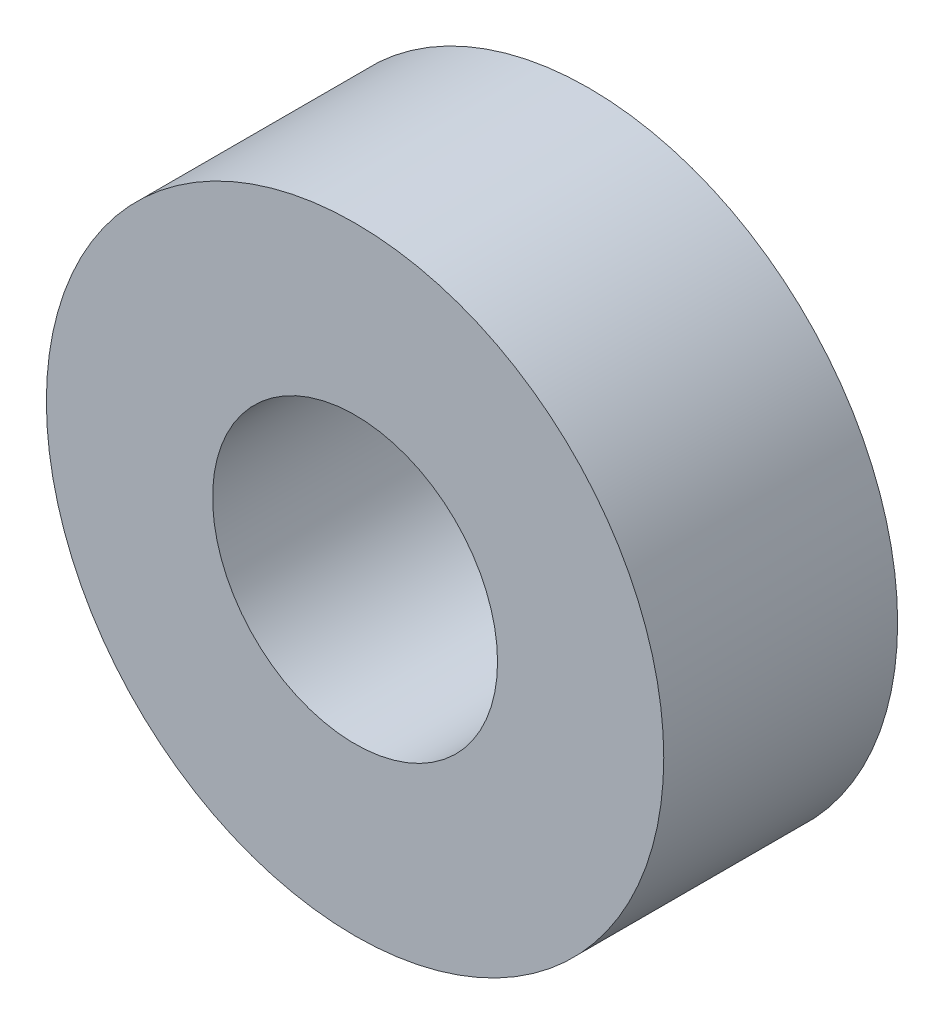
ISO-10303-21;
HEADER;
FILE_DESCRIPTION(('STEP AP214'),'2;1');
FILE_NAME('part.step','',(''),(''),'','','');
FILE_SCHEMA(('AUTOMOTIVE_DESIGN { 1 0 10303 214 1 1 1 1 }'));
ENDSEC;
DATA;
#1=APPLICATION_CONTEXT('core data for automotive mechanical design processes');
#2=APPLICATION_PROTOCOL_DEFINITION('international standard','automotive_design',2000,#1);
#3=PRODUCT_CONTEXT('',#1,'mechanical');
#4=PRODUCT('Part','Part','',(#3));
#5=PRODUCT_RELATED_PRODUCT_CATEGORY('part','',(#4));
#6=PRODUCT_DEFINITION_FORMATION('','',#4);
#7=PRODUCT_DEFINITION_CONTEXT('part definition',#1,'design');
#8=PRODUCT_DEFINITION('design','',#6,#7);
#9=PRODUCT_DEFINITION_SHAPE('','',#8);
#10=(LENGTH_UNIT() NAMED_UNIT(*) SI_UNIT(.MILLI.,.METRE.));
#11=(NAMED_UNIT(*) PLANE_ANGLE_UNIT() SI_UNIT($,.RADIAN.));
#12=(NAMED_UNIT(*) SI_UNIT($,.STERADIAN.) SOLID_ANGLE_UNIT());
#13=UNCERTAINTY_MEASURE_WITH_UNIT(LENGTH_MEASURE(1.E-05),#10,'distance_accuracy_value','');
#14=(GEOMETRIC_REPRESENTATION_CONTEXT(3) GLOBAL_UNCERTAINTY_ASSIGNED_CONTEXT((#13)) GLOBAL_UNIT_ASSIGNED_CONTEXT((#10,
#11,#12)) REPRESENTATION_CONTEXT('',''));
#15=CARTESIAN_POINT('',(0.,0.,0.));
#16=DIRECTION('',(0.,0.,1.));
#17=DIRECTION('',(1.,0.,0.));
#18=AXIS2_PLACEMENT_3D('',#15,#16,#17);
#19=CARTESIAN_POINT('',(0.,0.,5.));
#20=DIRECTION('',(0.,0.,1.));
#21=DIRECTION('',(1.,0.,0.));
#22=AXIS2_PLACEMENT_3D('',#19,#20,#21);
#23=PLANE('',#22);
#24=CARTESIAN_POINT('',(0.,0.,5.));
#25=DIRECTION('',(0.,0.,1.));
#26=DIRECTION('',(1.,0.,0.));
#27=AXIS2_PLACEMENT_3D('',#24,#25,#26);
#28=CIRCLE('',#27,6.6);
#29=CARTESIAN_POINT('',(6.6,0.,5.));
#30=VERTEX_POINT('',#29);
#31=EDGE_CURVE('E10',#30,#30,#28,.T.);
#32=ORIENTED_EDGE('',*,*,#31,.T.);
#33=EDGE_LOOP('',(#32));
#34=FACE_BOUND('',#33,.T.);
#35=CARTESIAN_POINT('',(0.,0.,5.));
#36=DIRECTION('',(0.,0.,1.));
#37=DIRECTION('',(1.,0.,0.));
#38=AXIS2_PLACEMENT_3D('',#35,#36,#37);
#39=CIRCLE('',#38,3.04615384615385);
#40=CARTESIAN_POINT('',(3.04615384615385,0.,5.));
#41=VERTEX_POINT('',#40);
#42=EDGE_CURVE('E42',#41,#41,#39,.T.);
#43=ORIENTED_EDGE('',*,*,#42,.F.);
#44=EDGE_LOOP('',(#43));
#45=FACE_BOUND('',#44,.T.);
#46=ADVANCED_FACE('F31',(#34,#45),#23,.T.);
#47=CARTESIAN_POINT('',(0.,0.,0.));
#48=DIRECTION('',(0.,0.,1.));
#49=DIRECTION('',(1.,0.,0.));
#50=AXIS2_PLACEMENT_3D('',#47,#48,#49);
#51=PLANE('',#50);
#52=CARTESIAN_POINT('',(0.,0.,0.));
#53=DIRECTION('',(0.,0.,1.));
#54=DIRECTION('',(1.,0.,0.));
#55=AXIS2_PLACEMENT_3D('',#52,#53,#54);
#56=CIRCLE('',#55,6.6);
#57=CARTESIAN_POINT('',(6.6,0.,0.));
#58=VERTEX_POINT('',#57);
#59=EDGE_CURVE('E35',#58,#58,#56,.T.);
#60=ORIENTED_EDGE('',*,*,#59,.F.);
#61=EDGE_LOOP('',(#60));
#62=FACE_BOUND('',#61,.T.);
#63=CARTESIAN_POINT('',(0.,0.,0.));
#64=DIRECTION('',(0.,0.,1.));
#65=DIRECTION('',(1.,0.,0.));
#66=AXIS2_PLACEMENT_3D('',#63,#64,#65);
#67=CIRCLE('',#66,3.04615384615385);
#68=CARTESIAN_POINT('',(3.04615384615385,0.,0.));
#69=VERTEX_POINT('',#68);
#70=EDGE_CURVE('E44',#69,#69,#67,.T.);
#71=ORIENTED_EDGE('',*,*,#70,.T.);
#72=EDGE_LOOP('',(#71));
#73=FACE_BOUND('',#72,.T.);
#74=ADVANCED_FACE('F54',(#62,#73),#51,.F.);
#75=CARTESIAN_POINT('',(0.,0.,5.));
#76=DIRECTION('',(0.,0.,-1.));
#77=DIRECTION('',(-1.,0.,0.));
#78=AXIS2_PLACEMENT_3D('',#75,#76,#77);
#79=CYLINDRICAL_SURFACE('',#78,6.6);
#80=ORIENTED_EDGE('',*,*,#31,.F.);
#81=EDGE_LOOP('',(#80));
#82=FACE_BOUND('',#81,.T.);
#83=ORIENTED_EDGE('',*,*,#59,.T.);
#84=EDGE_LOOP('',(#83));
#85=FACE_BOUND('',#84,.T.);
#86=ADVANCED_FACE('F33',(#82,#85),#79,.T.);
#87=CARTESIAN_POINT('',(0.,0.,5.));
#88=DIRECTION('',(0.,0.,-1.));
#89=DIRECTION('',(-1.,0.,0.));
#90=AXIS2_PLACEMENT_3D('',#87,#88,#89);
#91=CYLINDRICAL_SURFACE('',#90,3.04615384615385);
#92=ORIENTED_EDGE('',*,*,#42,.T.);
#93=EDGE_LOOP('',(#92));
#94=FACE_BOUND('',#93,.T.);
#95=ORIENTED_EDGE('',*,*,#70,.F.);
#96=EDGE_LOOP('',(#95));
#97=FACE_BOUND('',#96,.T.);
#98=ADVANCED_FACE('F50',(#94,#97),#91,.F.);
#99=CLOSED_SHELL('',(#46,#74,#86,#98));
#100=MANIFOLD_SOLID_BREP('B2',#99);
#101=ADVANCED_BREP_SHAPE_REPRESENTATION('',(#18,#100),#14);
#102=SHAPE_DEFINITION_REPRESENTATION(#9,#101);
ENDSEC;
END-ISO-10303-21;
